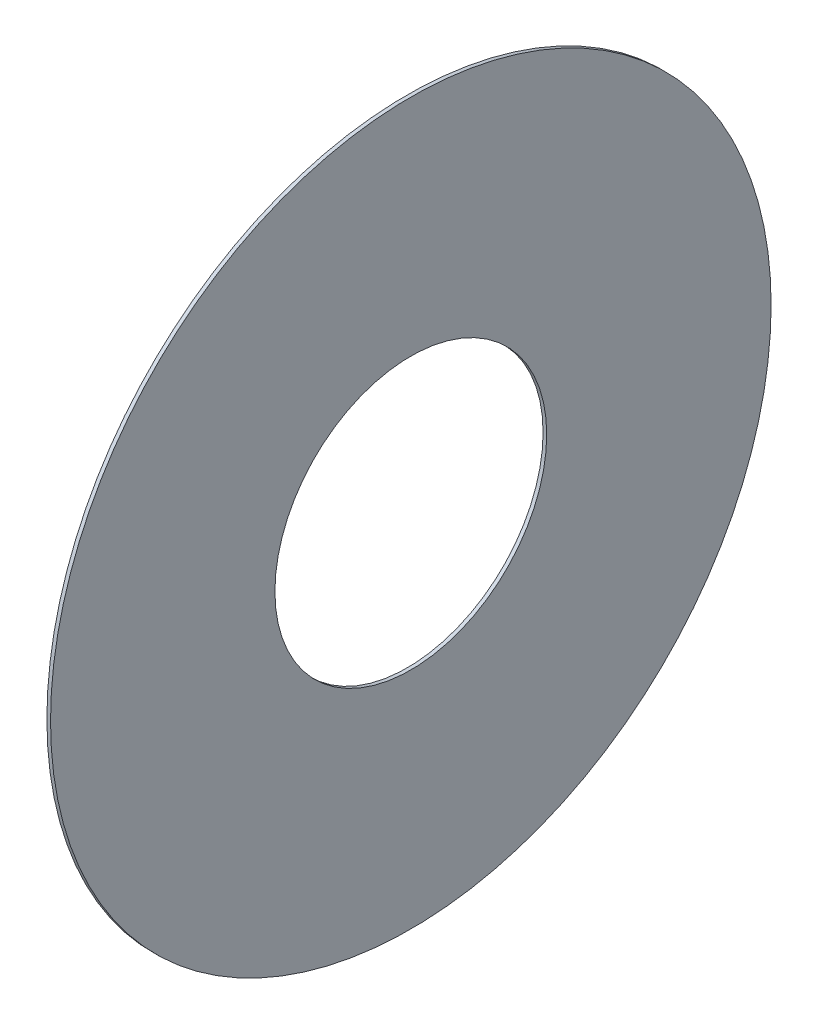
ISO-10303-21;
HEADER;
FILE_DESCRIPTION(('STEP AP214'),'2;1');
FILE_NAME('part.step','',(''),(''),'','','');
FILE_SCHEMA(('AUTOMOTIVE_DESIGN { 1 0 10303 214 1 1 1 1 }'));
ENDSEC;
DATA;
#1=APPLICATION_CONTEXT('core data for automotive mechanical design processes');
#2=APPLICATION_PROTOCOL_DEFINITION('international standard','automotive_design',2000,#1);
#3=PRODUCT_CONTEXT('',#1,'mechanical');
#4=PRODUCT('Part','Part','',(#3));
#5=PRODUCT_RELATED_PRODUCT_CATEGORY('part','',(#4));
#6=PRODUCT_DEFINITION_FORMATION('','',#4);
#7=PRODUCT_DEFINITION_CONTEXT('part definition',#1,'design');
#8=PRODUCT_DEFINITION('design','',#6,#7);
#9=PRODUCT_DEFINITION_SHAPE('','',#8);
#10=(LENGTH_UNIT() NAMED_UNIT(*) SI_UNIT(.MILLI.,.METRE.));
#11=(NAMED_UNIT(*) PLANE_ANGLE_UNIT() SI_UNIT($,.RADIAN.));
#12=(NAMED_UNIT(*) SI_UNIT($,.STERADIAN.) SOLID_ANGLE_UNIT());
#13=UNCERTAINTY_MEASURE_WITH_UNIT(LENGTH_MEASURE(1.E-05),#10,'distance_accuracy_value','');
#14=(GEOMETRIC_REPRESENTATION_CONTEXT(3) GLOBAL_UNCERTAINTY_ASSIGNED_CONTEXT((#13)) GLOBAL_UNIT_ASSIGNED_CONTEXT((#10,
#11,#12)) REPRESENTATION_CONTEXT('',''));
#15=CARTESIAN_POINT('',(0.,0.,0.));
#16=DIRECTION('',(0.,0.,1.));
#17=DIRECTION('',(1.,0.,0.));
#18=AXIS2_PLACEMENT_3D('',#15,#16,#17);
#19=CARTESIAN_POINT('',(0.60706,0.,0.));
#20=DIRECTION('',(1.,0.,0.));
#21=DIRECTION('',(0.,0.,-1.));
#22=AXIS2_PLACEMENT_3D('',#19,#20,#21);
#23=PLANE('',#22);
#24=CARTESIAN_POINT('',(0.60706,0.,0.));
#25=DIRECTION('',(1.,0.,0.));
#26=DIRECTION('',(0.,0.,-1.));
#27=AXIS2_PLACEMENT_3D('',#24,#25,#26);
#28=CIRCLE('',#27,60.17006);
#29=CARTESIAN_POINT('',(0.60706,0.,60.17006));
#30=VERTEX_POINT('',#29);
#31=EDGE_CURVE('E10',#30,#30,#28,.T.);
#32=ORIENTED_EDGE('',*,*,#31,.T.);
#33=EDGE_LOOP('',(#32));
#34=FACE_BOUND('',#33,.T.);
#35=CARTESIAN_POINT('',(0.60706,0.,0.));
#36=DIRECTION('',(1.,0.,0.));
#37=DIRECTION('',(0.,0.,-1.));
#38=AXIS2_PLACEMENT_3D('',#35,#36,#37);
#39=CIRCLE('',#38,22.69744);
#40=CARTESIAN_POINT('',(0.60706,0.,22.69744));
#41=VERTEX_POINT('',#40);
#42=EDGE_CURVE('E54',#41,#41,#39,.T.);
#43=ORIENTED_EDGE('',*,*,#42,.F.);
#44=EDGE_LOOP('',(#43));
#45=FACE_BOUND('',#44,.T.);
#46=ADVANCED_FACE('F41',(#34,#45),#23,.T.);
#47=CARTESIAN_POINT('',(0.,0.,0.));
#48=DIRECTION('',(1.,0.,0.));
#49=DIRECTION('',(0.,0.,-1.));
#50=AXIS2_PLACEMENT_3D('',#47,#48,#49);
#51=PLANE('',#50);
#52=CARTESIAN_POINT('',(0.,0.,0.));
#53=DIRECTION('',(1.,0.,0.));
#54=DIRECTION('',(0.,0.,-1.));
#55=AXIS2_PLACEMENT_3D('',#52,#53,#54);
#56=CIRCLE('',#55,60.17006);
#57=CARTESIAN_POINT('',(0.,0.,60.17006));
#58=VERTEX_POINT('',#57);
#59=EDGE_CURVE('E45',#58,#58,#56,.T.);
#60=ORIENTED_EDGE('',*,*,#59,.F.);
#61=EDGE_LOOP('',(#60));
#62=FACE_BOUND('',#61,.T.);
#63=CARTESIAN_POINT('',(0.,0.,0.));
#64=DIRECTION('',(1.,0.,0.));
#65=DIRECTION('',(0.,0.,-1.));
#66=AXIS2_PLACEMENT_3D('',#63,#64,#65);
#67=CIRCLE('',#66,22.69744);
#68=CARTESIAN_POINT('',(0.,0.,22.69744));
#69=VERTEX_POINT('',#68);
#70=EDGE_CURVE('E56',#69,#69,#67,.T.);
#71=ORIENTED_EDGE('',*,*,#70,.T.);
#72=EDGE_LOOP('',(#71));
#73=FACE_BOUND('',#72,.T.);
#74=ADVANCED_FACE('F68',(#62,#73),#51,.F.);
#75=CARTESIAN_POINT('',(0.60706,0.,0.));
#76=DIRECTION('',(-1.,0.,0.));
#77=DIRECTION('',(0.,0.,1.));
#78=AXIS2_PLACEMENT_3D('',#75,#76,#77);
#79=CYLINDRICAL_SURFACE('',#78,60.17006);
#80=CARTESIAN_POINT('',(0.60706,0.,60.17006));
#81=CARTESIAN_POINT('',(0.600736458333333,0.,60.17006));
#82=CARTESIAN_POINT('',(0.594412916666667,0.,60.17006));
#83=CARTESIAN_POINT('',(0.581765833333333,0.,60.17006));
#84=CARTESIAN_POINT('',(0.575442291666666,0.,60.17006));
#85=CARTESIAN_POINT('',(0.562795208333333,0.,60.17006));
#86=CARTESIAN_POINT('',(0.556471666666667,0.,60.17006));
#87=CARTESIAN_POINT('',(0.543824583333333,0.,60.17006));
#88=CARTESIAN_POINT('',(0.537501041666667,0.,60.17006));
#89=CARTESIAN_POINT('',(0.524853958333333,0.,60.17006));
#90=CARTESIAN_POINT('',(0.518530416666667,0.,60.17006));
#91=CARTESIAN_POINT('',(0.505883333333333,0.,60.17006));
#92=CARTESIAN_POINT('',(0.499559791666667,0.,60.17006));
#93=CARTESIAN_POINT('',(0.486912708333333,0.,60.17006));
#94=CARTESIAN_POINT('',(0.480589166666667,0.,60.17006));
#95=CARTESIAN_POINT('',(0.467942083333333,0.,60.17006));
#96=CARTESIAN_POINT('',(0.461618541666667,0.,60.17006));
#97=CARTESIAN_POINT('',(0.448971458333333,0.,60.17006));
#98=CARTESIAN_POINT('',(0.442647916666667,0.,60.17006));
#99=CARTESIAN_POINT('',(0.430000833333333,0.,60.17006));
#100=CARTESIAN_POINT('',(0.423677291666667,0.,60.17006));
#101=CARTESIAN_POINT('',(0.411030208333333,0.,60.17006));
#102=CARTESIAN_POINT('',(0.404706666666667,0.,60.17006));
#103=CARTESIAN_POINT('',(0.392059583333333,0.,60.17006));
#104=CARTESIAN_POINT('',(0.385736041666667,0.,60.17006));
#105=CARTESIAN_POINT('',(0.373088958333333,0.,60.17006));
#106=CARTESIAN_POINT('',(0.366765416666667,0.,60.17006));
#107=CARTESIAN_POINT('',(0.354118333333333,0.,60.17006));
#108=CARTESIAN_POINT('',(0.347794791666667,0.,60.17006));
#109=CARTESIAN_POINT('',(0.335147708333333,0.,60.17006));
#110=CARTESIAN_POINT('',(0.328824166666667,0.,60.17006));
#111=CARTESIAN_POINT('',(0.316177083333333,0.,60.17006));
#112=CARTESIAN_POINT('',(0.309853541666667,0.,60.17006));
#113=CARTESIAN_POINT('',(0.297206458333333,0.,60.17006));
#114=CARTESIAN_POINT('',(0.290882916666667,0.,60.17006));
#115=CARTESIAN_POINT('',(0.278235833333333,0.,60.17006));
#116=CARTESIAN_POINT('',(0.271912291666667,0.,60.17006));
#117=CARTESIAN_POINT('',(0.259265208333333,0.,60.17006));
#118=CARTESIAN_POINT('',(0.252941666666667,0.,60.17006));
#119=CARTESIAN_POINT('',(0.240294583333333,0.,60.17006));
#120=CARTESIAN_POINT('',(0.233971041666667,0.,60.17006));
#121=CARTESIAN_POINT('',(0.221323958333333,0.,60.17006));
#122=CARTESIAN_POINT('',(0.215000416666667,0.,60.17006));
#123=CARTESIAN_POINT('',(0.202353333333333,0.,60.17006));
#124=CARTESIAN_POINT('',(0.196029791666667,0.,60.17006));
#125=CARTESIAN_POINT('',(0.183382708333333,0.,60.17006));
#126=CARTESIAN_POINT('',(0.177059166666667,0.,60.17006));
#127=CARTESIAN_POINT('',(0.164412083333333,0.,60.17006));
#128=CARTESIAN_POINT('',(0.158088541666667,0.,60.17006));
#129=CARTESIAN_POINT('',(0.145441458333333,0.,60.17006));
#130=CARTESIAN_POINT('',(0.139117916666667,0.,60.17006));
#131=CARTESIAN_POINT('',(0.126470833333333,0.,60.17006));
#132=CARTESIAN_POINT('',(0.120147291666667,0.,60.17006));
#133=CARTESIAN_POINT('',(0.107500208333333,0.,60.17006));
#134=CARTESIAN_POINT('',(0.101176666666667,0.,60.17006));
#135=CARTESIAN_POINT('',(0.0885295833333333,0.,60.17006));
#136=CARTESIAN_POINT('',(0.0822060416666666,0.,60.17006));
#137=CARTESIAN_POINT('',(0.0695589583333333,0.,60.17006));
#138=CARTESIAN_POINT('',(0.0632354166666665,0.,60.17006));
#139=CARTESIAN_POINT('',(0.0505883333333332,0.,60.17006));
#140=CARTESIAN_POINT('',(0.0442647916666665,0.,60.17006));
#141=CARTESIAN_POINT('',(0.0316177083333332,0.,60.17006));
#142=CARTESIAN_POINT('',(0.0252941666666665,0.,60.17006));
#143=CARTESIAN_POINT('',(0.0126470833333332,0.,60.17006));
#144=CARTESIAN_POINT('',(0.00632354166666655,0.,60.17006));
#145=CARTESIAN_POINT('',(0.,0.,60.17006));
#146=B_SPLINE_CURVE_WITH_KNOTS('',3,(#80,#81,#82,#83,#84,#85,#86,#87,#88,#89,#90,#91,#92,#93,
#94,#95,#96,#97,#98,#99,#100,#101,#102,#103,#104,#105,#106,#107,#108,#109,#110,#111,#112,#113,
#114,#115,#116,#117,#118,#119,#120,#121,#122,#123,#124,#125,#126,#127,#128,#129,#130,#131,#132,
#133,#134,#135,#136,#137,#138,#139,#140,#141,#142,#143,#144,#145),.UNSPECIFIED.,.F.,.F.,(4,2,2,
2,2,2,2,2,2,2,2,2,2,2,2,2,2,2,2,2,2,2,2,2,2,2,2,2,2,2,2,2,4),(0.,0.018970625,0.03794125,
0.056911875,0.0758824999999999,0.0948531249999999,0.11382375,0.132794375,0.151765,0.170735625,
0.18970625,0.208676875,0.2276475,0.246618125,0.26558875,0.284559375,0.30353,0.322500625,
0.34147125,0.360441875,0.3794125,0.398383125,0.41735375,0.436324375,0.455295,0.474265625,
0.49323625,0.512206875,0.5311775,0.550148125,0.56911875,0.588089375,0.60706),.UNSPECIFIED.);
#147=EDGE_CURVE('BSEAM43',#30,#58,#146,.T.);
#148=ORIENTED_EDGE('',*,*,#31,.F.);
#149=ORIENTED_EDGE('',*,*,#59,.T.);
#150=ORIENTED_EDGE('',*,*,#147,.T.);
#151=ORIENTED_EDGE('',*,*,#147,.F.);
#152=EDGE_LOOP('',(#148,#150,#149,#151));
#153=FACE_BOUND('',#152,.T.);
#154=ADVANCED_FACE('F43',(#153),#79,.T.);
#155=CARTESIAN_POINT('',(0.60706,0.,0.));
#156=DIRECTION('',(-1.,0.,0.));
#157=DIRECTION('',(0.,0.,1.));
#158=AXIS2_PLACEMENT_3D('',#155,#156,#157);
#159=CYLINDRICAL_SURFACE('',#158,22.69744);
#160=CARTESIAN_POINT('',(0.60706,0.,22.69744));
#161=CARTESIAN_POINT('',(0.600736458333333,0.,22.69744));
#162=CARTESIAN_POINT('',(0.594412916666667,0.,22.69744));
#163=CARTESIAN_POINT('',(0.581765833333333,0.,22.69744));
#164=CARTESIAN_POINT('',(0.575442291666666,0.,22.69744));
#165=CARTESIAN_POINT('',(0.562795208333333,0.,22.69744));
#166=CARTESIAN_POINT('',(0.556471666666667,0.,22.69744));
#167=CARTESIAN_POINT('',(0.543824583333333,0.,22.69744));
#168=CARTESIAN_POINT('',(0.537501041666667,0.,22.69744));
#169=CARTESIAN_POINT('',(0.524853958333333,0.,22.69744));
#170=CARTESIAN_POINT('',(0.518530416666667,0.,22.69744));
#171=CARTESIAN_POINT('',(0.505883333333333,0.,22.69744));
#172=CARTESIAN_POINT('',(0.499559791666667,0.,22.69744));
#173=CARTESIAN_POINT('',(0.486912708333333,0.,22.69744));
#174=CARTESIAN_POINT('',(0.480589166666667,0.,22.69744));
#175=CARTESIAN_POINT('',(0.467942083333333,0.,22.69744));
#176=CARTESIAN_POINT('',(0.461618541666667,0.,22.69744));
#177=CARTESIAN_POINT('',(0.448971458333333,0.,22.69744));
#178=CARTESIAN_POINT('',(0.442647916666667,0.,22.69744));
#179=CARTESIAN_POINT('',(0.430000833333333,0.,22.69744));
#180=CARTESIAN_POINT('',(0.423677291666667,0.,22.69744));
#181=CARTESIAN_POINT('',(0.411030208333333,0.,22.69744));
#182=CARTESIAN_POINT('',(0.404706666666667,0.,22.69744));
#183=CARTESIAN_POINT('',(0.392059583333333,0.,22.69744));
#184=CARTESIAN_POINT('',(0.385736041666667,0.,22.69744));
#185=CARTESIAN_POINT('',(0.373088958333333,0.,22.69744));
#186=CARTESIAN_POINT('',(0.366765416666667,0.,22.69744));
#187=CARTESIAN_POINT('',(0.354118333333333,0.,22.69744));
#188=CARTESIAN_POINT('',(0.347794791666667,0.,22.69744));
#189=CARTESIAN_POINT('',(0.335147708333333,0.,22.69744));
#190=CARTESIAN_POINT('',(0.328824166666667,0.,22.69744));
#191=CARTESIAN_POINT('',(0.316177083333333,0.,22.69744));
#192=CARTESIAN_POINT('',(0.309853541666667,0.,22.69744));
#193=CARTESIAN_POINT('',(0.297206458333333,0.,22.69744));
#194=CARTESIAN_POINT('',(0.290882916666667,0.,22.69744));
#195=CARTESIAN_POINT('',(0.278235833333333,0.,22.69744));
#196=CARTESIAN_POINT('',(0.271912291666667,0.,22.69744));
#197=CARTESIAN_POINT('',(0.259265208333333,0.,22.69744));
#198=CARTESIAN_POINT('',(0.252941666666667,0.,22.69744));
#199=CARTESIAN_POINT('',(0.240294583333333,0.,22.69744));
#200=CARTESIAN_POINT('',(0.233971041666667,0.,22.69744));
#201=CARTESIAN_POINT('',(0.221323958333333,0.,22.69744));
#202=CARTESIAN_POINT('',(0.215000416666667,0.,22.69744));
#203=CARTESIAN_POINT('',(0.202353333333333,0.,22.69744));
#204=CARTESIAN_POINT('',(0.196029791666667,0.,22.69744));
#205=CARTESIAN_POINT('',(0.183382708333333,0.,22.69744));
#206=CARTESIAN_POINT('',(0.177059166666667,0.,22.69744));
#207=CARTESIAN_POINT('',(0.164412083333333,0.,22.69744));
#208=CARTESIAN_POINT('',(0.158088541666667,0.,22.69744));
#209=CARTESIAN_POINT('',(0.145441458333333,0.,22.69744));
#210=CARTESIAN_POINT('',(0.139117916666667,0.,22.69744));
#211=CARTESIAN_POINT('',(0.126470833333333,0.,22.69744));
#212=CARTESIAN_POINT('',(0.120147291666667,0.,22.69744));
#213=CARTESIAN_POINT('',(0.107500208333333,0.,22.69744));
#214=CARTESIAN_POINT('',(0.101176666666667,0.,22.69744));
#215=CARTESIAN_POINT('',(0.0885295833333333,0.,22.69744));
#216=CARTESIAN_POINT('',(0.0822060416666666,0.,22.69744));
#217=CARTESIAN_POINT('',(0.0695589583333333,0.,22.69744));
#218=CARTESIAN_POINT('',(0.0632354166666665,0.,22.69744));
#219=CARTESIAN_POINT('',(0.0505883333333332,0.,22.69744));
#220=CARTESIAN_POINT('',(0.0442647916666665,0.,22.69744));
#221=CARTESIAN_POINT('',(0.0316177083333332,0.,22.69744));
#222=CARTESIAN_POINT('',(0.0252941666666665,0.,22.69744));
#223=CARTESIAN_POINT('',(0.0126470833333332,0.,22.69744));
#224=CARTESIAN_POINT('',(0.00632354166666655,0.,22.69744));
#225=CARTESIAN_POINT('',(0.,0.,22.69744));
#226=B_SPLINE_CURVE_WITH_KNOTS('',3,(#160,#161,#162,#163,#164,#165,#166,#167,#168,#169,#170,
#171,#172,#173,#174,#175,#176,#177,#178,#179,#180,#181,#182,#183,#184,#185,#186,#187,#188,#189,
#190,#191,#192,#193,#194,#195,#196,#197,#198,#199,#200,#201,#202,#203,#204,#205,#206,#207,#208,
#209,#210,#211,#212,#213,#214,#215,#216,#217,#218,#219,#220,#221,#222,#223,#224,#225),
.UNSPECIFIED.,.F.,.F.,(4,2,2,2,2,2,2,2,2,2,2,2,2,2,2,2,2,2,2,2,2,2,2,2,2,2,2,2,2,2,2,2,4),(0.,
0.018970625,0.03794125,0.056911875,0.0758824999999999,0.0948531249999999,0.11382375,0.132794375,
0.151765,0.170735625,0.18970625,0.208676875,0.2276475,0.246618125,0.26558875,0.284559375,
0.30353,0.322500625,0.34147125,0.360441875,0.3794125,0.398383125,0.41735375,0.436324375,
0.455295,0.474265625,0.49323625,0.512206875,0.5311775,0.550148125,0.56911875,0.588089375,
0.60706),.UNSPECIFIED.);
#227=EDGE_CURVE('BSEAM64',#41,#69,#226,.T.);
#228=ORIENTED_EDGE('',*,*,#42,.T.);
#229=ORIENTED_EDGE('',*,*,#70,.F.);
#230=ORIENTED_EDGE('',*,*,#227,.T.);
#231=ORIENTED_EDGE('',*,*,#227,.F.);
#232=EDGE_LOOP('',(#228,#230,#229,#231));
#233=FACE_BOUND('',#232,.T.);
#234=ADVANCED_FACE('F64',(#233),#159,.F.);
#235=CLOSED_SHELL('',(#46,#74,#154,#234));
#236=MANIFOLD_SOLID_BREP('B2',#235);
#237=ADVANCED_BREP_SHAPE_REPRESENTATION('',(#18,#236),#14);
#238=SHAPE_DEFINITION_REPRESENTATION(#9,#237);
ENDSEC;
END-ISO-10303-21;
